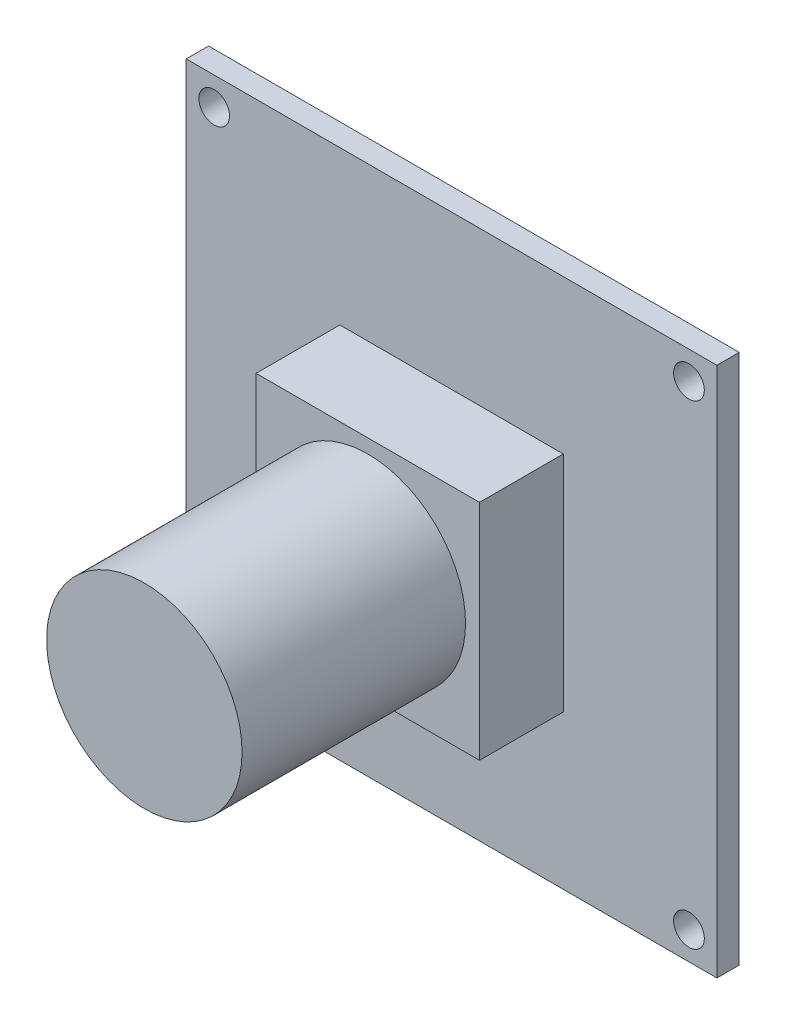
ISO-10303-21;
HEADER;
FILE_DESCRIPTION(('STEP AP214'),'2;1');
FILE_NAME('part.step','',(''),(''),'','','');
FILE_SCHEMA(('AUTOMOTIVE_DESIGN { 1 0 10303 214 1 1 1 1 }'));
ENDSEC;
DATA;
#1=APPLICATION_CONTEXT('core data for automotive mechanical design processes');
#2=APPLICATION_PROTOCOL_DEFINITION('international standard','automotive_design',2000,#1);
#3=PRODUCT_CONTEXT('',#1,'mechanical');
#4=PRODUCT('Part','Part','',(#3));
#5=PRODUCT_RELATED_PRODUCT_CATEGORY('part','',(#4));
#6=PRODUCT_DEFINITION_FORMATION('','',#4);
#7=PRODUCT_DEFINITION_CONTEXT('part definition',#1,'design');
#8=PRODUCT_DEFINITION('design','',#6,#7);
#9=PRODUCT_DEFINITION_SHAPE('','',#8);
#10=(LENGTH_UNIT() NAMED_UNIT(*) SI_UNIT(.MILLI.,.METRE.));
#11=(NAMED_UNIT(*) PLANE_ANGLE_UNIT() SI_UNIT($,.RADIAN.));
#12=(NAMED_UNIT(*) SI_UNIT($,.STERADIAN.) SOLID_ANGLE_UNIT());
#13=UNCERTAINTY_MEASURE_WITH_UNIT(LENGTH_MEASURE(1.E-05),#10,'distance_accuracy_value','');
#14=(GEOMETRIC_REPRESENTATION_CONTEXT(3) GLOBAL_UNCERTAINTY_ASSIGNED_CONTEXT((#13)) GLOBAL_UNIT_ASSIGNED_CONTEXT((#10,
#11,#12)) REPRESENTATION_CONTEXT('',''));
#15=CARTESIAN_POINT('',(0.,0.,0.));
#16=DIRECTION('',(0.,0.,1.));
#17=DIRECTION('',(1.,0.,0.));
#18=AXIS2_PLACEMENT_3D('',#15,#16,#17);
#19=CARTESIAN_POINT('',(0.,0.,23.6));
#20=DIRECTION('',(0.,0.,1.));
#21=DIRECTION('',(1.,0.,0.));
#22=AXIS2_PLACEMENT_3D('',#19,#20,#21);
#23=PLANE('',#22);
#24=CARTESIAN_POINT('',(0.,0.,23.6));
#25=DIRECTION('',(0.,0.,1.));
#26=DIRECTION('',(1.,0.,0.));
#27=AXIS2_PLACEMENT_3D('',#24,#25,#26);
#28=CIRCLE('',#27,7.);
#29=CARTESIAN_POINT('',(7.,0.,23.6));
#30=VERTEX_POINT('',#29);
#31=EDGE_CURVE('E25',#30,#30,#28,.T.);
#32=ORIENTED_EDGE('',*,*,#31,.T.);
#33=EDGE_LOOP('',(#32));
#34=FACE_BOUND('',#33,.T.);
#35=ADVANCED_FACE('F14',(#34),#23,.T.);
#36=CARTESIAN_POINT('',(0.,0.,7.6));
#37=DIRECTION('',(0.,0.,1.));
#38=DIRECTION('',(1.,0.,0.));
#39=AXIS2_PLACEMENT_3D('',#36,#37,#38);
#40=CYLINDRICAL_SURFACE('',#39,7.);
#41=ORIENTED_EDGE('',*,*,#31,.F.);
#42=DIRECTION('',(0.,0.,1.));
#43=VECTOR('',#42,1.);
#44=CARTESIAN_POINT('',(7.,0.,7.6));
#45=LINE('',#44,#43);
#46=CARTESIAN_POINT('',(7.,0.,7.6));
#47=VERTEX_POINT('',#46);
#48=EDGE_CURVE('E9',#47,#30,#45,.T.);
#49=ORIENTED_EDGE('',*,*,#48,.F.);
#50=CARTESIAN_POINT('',(0.,0.,7.6));
#51=DIRECTION('',(0.,0.,1.));
#52=DIRECTION('',(1.,0.,0.));
#53=AXIS2_PLACEMENT_3D('',#50,#51,#52);
#54=CIRCLE('',#53,7.);
#55=EDGE_CURVE('E18',#47,#47,#54,.T.);
#56=ORIENTED_EDGE('',*,*,#55,.T.);
#57=ORIENTED_EDGE('',*,*,#48,.T.);
#58=EDGE_LOOP('',(#41,#49,#56,#57));
#59=FACE_BOUND('',#58,.T.);
#60=ADVANCED_FACE('F334',(#59),#40,.T.);
#61=CARTESIAN_POINT('',(-8.,-8.,7.6));
#62=DIRECTION('',(0.,0.,1.));
#63=DIRECTION('',(1.,0.,0.));
#64=AXIS2_PLACEMENT_3D('',#61,#62,#63);
#65=PLANE('',#64);
#66=ORIENTED_EDGE('',*,*,#55,.F.);
#67=EDGE_LOOP('',(#66));
#68=FACE_BOUND('',#67,.T.);
#69=DIRECTION('',(0.,1.,0.));
#70=VECTOR('',#69,1.);
#71=CARTESIAN_POINT('',(-8.,-8.,7.6));
#72=LINE('',#71,#70);
#73=CARTESIAN_POINT('',(-8.,-8.,7.6));
#74=VERTEX_POINT('',#73);
#75=CARTESIAN_POINT('',(-8.,8.,7.6));
#76=VERTEX_POINT('',#75);
#77=EDGE_CURVE('E206',#74,#76,#72,.T.);
#78=ORIENTED_EDGE('',*,*,#77,.F.);
#79=DIRECTION('',(1.,0.,0.));
#80=VECTOR('',#79,1.);
#81=CARTESIAN_POINT('',(-8.,-8.,7.6));
#82=LINE('',#81,#80);
#83=CARTESIAN_POINT('',(8.,-8.,7.6));
#84=VERTEX_POINT('',#83);
#85=EDGE_CURVE('E210',#74,#84,#82,.T.);
#86=ORIENTED_EDGE('',*,*,#85,.T.);
#87=DIRECTION('',(0.,1.,0.));
#88=VECTOR('',#87,1.);
#89=CARTESIAN_POINT('',(8.,-8.,7.6));
#90=LINE('',#89,#88);
#91=CARTESIAN_POINT('',(8.,8.,7.6));
#92=VERTEX_POINT('',#91);
#93=EDGE_CURVE('E234',#84,#92,#90,.T.);
#94=ORIENTED_EDGE('',*,*,#93,.T.);
#95=DIRECTION('',(1.,0.,0.));
#96=VECTOR('',#95,1.);
#97=CARTESIAN_POINT('',(-8.,8.,7.6));
#98=LINE('',#97,#96);
#99=EDGE_CURVE('E185',#76,#92,#98,.T.);
#100=ORIENTED_EDGE('',*,*,#99,.F.);
#101=EDGE_LOOP('',(#78,#86,#94,#100));
#102=FACE_BOUND('',#101,.T.);
#103=ADVANCED_FACE('F290',(#68,#102),#65,.T.);
#104=CARTESIAN_POINT('',(17.,17.,-2.5));
#105=DIRECTION('',(0.,0.,1.));
#106=DIRECTION('',(1.,0.,0.));
#107=AXIS2_PLACEMENT_3D('',#104,#105,#106);
#108=CYLINDRICAL_SURFACE('',#107,1.1);
#109=DIRECTION('',(0.,0.,1.));
#110=VECTOR('',#109,1.);
#111=CARTESIAN_POINT('',(18.1,17.,-2.5));
#112=LINE('',#111,#110);
#113=CARTESIAN_POINT('',(18.1,17.,0.));
#114=VERTEX_POINT('',#113);
#115=CARTESIAN_POINT('',(18.1,17.,1.6));
#116=VERTEX_POINT('',#115);
#117=EDGE_CURVE('E237',#114,#116,#112,.T.);
#118=ORIENTED_EDGE('',*,*,#117,.F.);
#119=CARTESIAN_POINT('',(17.,17.,0.));
#120=DIRECTION('',(0.,0.,1.));
#121=DIRECTION('',(1.,0.,0.));
#122=AXIS2_PLACEMENT_3D('',#119,#120,#121);
#123=CIRCLE('',#122,1.1);
#124=EDGE_CURVE('E178',#114,#114,#123,.T.);
#125=ORIENTED_EDGE('',*,*,#124,.F.);
#126=ORIENTED_EDGE('',*,*,#117,.T.);
#127=CARTESIAN_POINT('',(17.,17.,1.6));
#128=DIRECTION('',(0.,0.,1.));
#129=DIRECTION('',(1.,0.,0.));
#130=AXIS2_PLACEMENT_3D('',#127,#128,#129);
#131=CIRCLE('',#130,1.1);
#132=EDGE_CURVE('E153',#116,#116,#131,.T.);
#133=ORIENTED_EDGE('',*,*,#132,.T.);
#134=EDGE_LOOP('',(#118,#125,#126,#133));
#135=FACE_BOUND('',#134,.T.);
#136=ADVANCED_FACE('F346',(#135),#108,.F.);
#137=CARTESIAN_POINT('',(8.,-8.,1.6));
#138=DIRECTION('',(1.,0.,0.));
#139=DIRECTION('',(0.,1.,0.));
#140=AXIS2_PLACEMENT_3D('',#137,#138,#139);
#141=PLANE('',#140);
#142=DIRECTION('',(0.,0.,1.));
#143=VECTOR('',#142,1.);
#144=CARTESIAN_POINT('',(8.,-8.,1.6));
#145=LINE('',#144,#143);
#146=CARTESIAN_POINT('',(8.,-8.,1.6));
#147=VERTEX_POINT('',#146);
#148=EDGE_CURVE('E184',#147,#84,#145,.T.);
#149=ORIENTED_EDGE('',*,*,#148,.F.);
#150=DIRECTION('',(0.,1.,0.));
#151=VECTOR('',#150,1.);
#152=CARTESIAN_POINT('',(8.,-8.,1.6));
#153=LINE('',#152,#151);
#154=CARTESIAN_POINT('',(8.,8.,1.6));
#155=VERTEX_POINT('',#154);
#156=EDGE_CURVE('E219',#147,#155,#153,.T.);
#157=ORIENTED_EDGE('',*,*,#156,.T.);
#158=DIRECTION('',(0.,0.,1.));
#159=VECTOR('',#158,1.);
#160=CARTESIAN_POINT('',(8.,8.,1.6));
#161=LINE('',#160,#159);
#162=EDGE_CURVE('E180',#155,#92,#161,.T.);
#163=ORIENTED_EDGE('',*,*,#162,.T.);
#164=ORIENTED_EDGE('',*,*,#93,.F.);
#165=EDGE_LOOP('',(#149,#157,#163,#164));
#166=FACE_BOUND('',#165,.T.);
#167=ADVANCED_FACE('F293',(#166),#141,.T.);
#168=CARTESIAN_POINT('',(-8.,-8.,1.6));
#169=DIRECTION('',(0.,1.,0.));
#170=DIRECTION('',(1.,0.,0.));
#171=AXIS2_PLACEMENT_3D('',#168,#169,#170);
#172=PLANE('',#171);
#173=ORIENTED_EDGE('',*,*,#148,.T.);
#174=ORIENTED_EDGE('',*,*,#85,.F.);
#175=DIRECTION('',(0.,0.,1.));
#176=VECTOR('',#175,1.);
#177=CARTESIAN_POINT('',(-8.,-8.,1.6));
#178=LINE('',#177,#176);
#179=CARTESIAN_POINT('',(-8.,-8.,1.6));
#180=VERTEX_POINT('',#179);
#181=EDGE_CURVE('E267',#180,#74,#178,.T.);
#182=ORIENTED_EDGE('',*,*,#181,.F.);
#183=DIRECTION('',(1.,0.,0.));
#184=VECTOR('',#183,1.);
#185=CARTESIAN_POINT('',(-8.,-8.,1.6));
#186=LINE('',#185,#184);
#187=EDGE_CURVE('E227',#180,#147,#186,.T.);
#188=ORIENTED_EDGE('',*,*,#187,.T.);
#189=EDGE_LOOP('',(#173,#174,#182,#188));
#190=FACE_BOUND('',#189,.T.);
#191=ADVANCED_FACE('F345',(#190),#172,.F.);
#192=CARTESIAN_POINT('',(-8.,8.,1.6));
#193=DIRECTION('',(0.,1.,0.));
#194=DIRECTION('',(1.,0.,0.));
#195=AXIS2_PLACEMENT_3D('',#192,#193,#194);
#196=PLANE('',#195);
#197=DIRECTION('',(1.,0.,0.));
#198=VECTOR('',#197,1.);
#199=CARTESIAN_POINT('',(-8.,8.,1.6));
#200=LINE('',#199,#198);
#201=CARTESIAN_POINT('',(-8.,8.,1.6));
#202=VERTEX_POINT('',#201);
#203=EDGE_CURVE('E190',#202,#155,#200,.T.);
#204=ORIENTED_EDGE('',*,*,#203,.F.);
#205=DIRECTION('',(0.,0.,1.));
#206=VECTOR('',#205,1.);
#207=CARTESIAN_POINT('',(-8.,8.,1.6));
#208=LINE('',#207,#206);
#209=EDGE_CURVE('E222',#202,#76,#208,.T.);
#210=ORIENTED_EDGE('',*,*,#209,.T.);
#211=ORIENTED_EDGE('',*,*,#99,.T.);
#212=ORIENTED_EDGE('',*,*,#162,.F.);
#213=EDGE_LOOP('',(#204,#210,#211,#212));
#214=FACE_BOUND('',#213,.T.);
#215=ADVANCED_FACE('F286',(#214),#196,.T.);
#216=CARTESIAN_POINT('',(-8.,-8.,1.6));
#217=DIRECTION('',(1.,0.,0.));
#218=DIRECTION('',(0.,1.,0.));
#219=AXIS2_PLACEMENT_3D('',#216,#217,#218);
#220=PLANE('',#219);
#221=ORIENTED_EDGE('',*,*,#77,.T.);
#222=ORIENTED_EDGE('',*,*,#209,.F.);
#223=DIRECTION('',(0.,1.,0.));
#224=VECTOR('',#223,1.);
#225=CARTESIAN_POINT('',(-8.,-8.,1.6));
#226=LINE('',#225,#224);
#227=EDGE_CURVE('E186',#180,#202,#226,.T.);
#228=ORIENTED_EDGE('',*,*,#227,.F.);
#229=ORIENTED_EDGE('',*,*,#181,.T.);
#230=EDGE_LOOP('',(#221,#222,#228,#229));
#231=FACE_BOUND('',#230,.T.);
#232=ADVANCED_FACE('F16',(#231),#220,.F.);
#233=CARTESIAN_POINT('',(-17.,17.,-2.5));
#234=DIRECTION('',(0.,0.,1.));
#235=DIRECTION('',(1.,0.,0.));
#236=AXIS2_PLACEMENT_3D('',#233,#234,#235);
#237=CYLINDRICAL_SURFACE('',#236,1.1);
#238=DIRECTION('',(0.,0.,1.));
#239=VECTOR('',#238,1.);
#240=CARTESIAN_POINT('',(-15.9,17.,-2.5));
#241=LINE('',#240,#239);
#242=CARTESIAN_POINT('',(-15.9,17.,0.));
#243=VERTEX_POINT('',#242);
#244=CARTESIAN_POINT('',(-15.9,17.,1.6));
#245=VERTEX_POINT('',#244);
#246=EDGE_CURVE('E75',#243,#245,#241,.T.);
#247=ORIENTED_EDGE('',*,*,#246,.F.);
#248=CARTESIAN_POINT('',(-17.,17.,0.));
#249=DIRECTION('',(0.,0.,1.));
#250=DIRECTION('',(1.,0.,0.));
#251=AXIS2_PLACEMENT_3D('',#248,#249,#250);
#252=CIRCLE('',#251,1.1);
#253=EDGE_CURVE('E256',#243,#243,#252,.T.);
#254=ORIENTED_EDGE('',*,*,#253,.F.);
#255=ORIENTED_EDGE('',*,*,#246,.T.);
#256=CARTESIAN_POINT('',(-17.,17.,1.6));
#257=DIRECTION('',(0.,0.,1.));
#258=DIRECTION('',(1.,0.,0.));
#259=AXIS2_PLACEMENT_3D('',#256,#257,#258);
#260=CIRCLE('',#259,1.1);
#261=EDGE_CURVE('E191',#245,#245,#260,.T.);
#262=ORIENTED_EDGE('',*,*,#261,.T.);
#263=EDGE_LOOP('',(#247,#254,#255,#262));
#264=FACE_BOUND('',#263,.T.);
#265=ADVANCED_FACE('F347',(#264),#237,.F.);
#266=CARTESIAN_POINT('',(17.,-17.,-2.5));
#267=DIRECTION('',(0.,0.,1.));
#268=DIRECTION('',(1.,0.,0.));
#269=AXIS2_PLACEMENT_3D('',#266,#267,#268);
#270=CYLINDRICAL_SURFACE('',#269,1.1);
#271=DIRECTION('',(0.,0.,1.));
#272=VECTOR('',#271,1.);
#273=CARTESIAN_POINT('',(18.1,-17.,-2.5));
#274=LINE('',#273,#272);
#275=CARTESIAN_POINT('',(18.1,-17.,0.));
#276=VERTEX_POINT('',#275);
#277=CARTESIAN_POINT('',(18.1,-17.,1.6));
#278=VERTEX_POINT('',#277);
#279=EDGE_CURVE('E91',#276,#278,#274,.T.);
#280=ORIENTED_EDGE('',*,*,#279,.F.);
#281=CARTESIAN_POINT('',(17.,-17.,0.));
#282=DIRECTION('',(0.,0.,1.));
#283=DIRECTION('',(1.,0.,0.));
#284=AXIS2_PLACEMENT_3D('',#281,#282,#283);
#285=CIRCLE('',#284,1.1);
#286=EDGE_CURVE('E253',#276,#276,#285,.T.);
#287=ORIENTED_EDGE('',*,*,#286,.F.);
#288=ORIENTED_EDGE('',*,*,#279,.T.);
#289=CARTESIAN_POINT('',(17.,-17.,1.6));
#290=DIRECTION('',(0.,0.,1.));
#291=DIRECTION('',(1.,0.,0.));
#292=AXIS2_PLACEMENT_3D('',#289,#290,#291);
#293=CIRCLE('',#292,1.1);
#294=EDGE_CURVE('E261',#278,#278,#293,.T.);
#295=ORIENTED_EDGE('',*,*,#294,.T.);
#296=EDGE_LOOP('',(#280,#287,#288,#295));
#297=FACE_BOUND('',#296,.T.);
#298=ADVANCED_FACE('F349',(#297),#270,.F.);
#299=CARTESIAN_POINT('',(-17.,-17.,-2.5));
#300=DIRECTION('',(0.,0.,1.));
#301=DIRECTION('',(1.,0.,0.));
#302=AXIS2_PLACEMENT_3D('',#299,#300,#301);
#303=CYLINDRICAL_SURFACE('',#302,1.1);
#304=DIRECTION('',(0.,0.,1.));
#305=VECTOR('',#304,1.);
#306=CARTESIAN_POINT('',(-15.9,-17.,-2.5));
#307=LINE('',#306,#305);
#308=CARTESIAN_POINT('',(-15.9,-17.,0.));
#309=VERTEX_POINT('',#308);
#310=CARTESIAN_POINT('',(-15.9,-17.,1.6));
#311=VERTEX_POINT('',#310);
#312=EDGE_CURVE('E243',#309,#311,#307,.T.);
#313=ORIENTED_EDGE('',*,*,#312,.F.);
#314=CARTESIAN_POINT('',(-17.,-17.,0.));
#315=DIRECTION('',(0.,0.,1.));
#316=DIRECTION('',(1.,0.,0.));
#317=AXIS2_PLACEMENT_3D('',#314,#315,#316);
#318=CIRCLE('',#317,1.1);
#319=EDGE_CURVE('E240',#309,#309,#318,.T.);
#320=ORIENTED_EDGE('',*,*,#319,.F.);
#321=ORIENTED_EDGE('',*,*,#312,.T.);
#322=CARTESIAN_POINT('',(-17.,-17.,1.6));
#323=DIRECTION('',(0.,0.,1.));
#324=DIRECTION('',(1.,0.,0.));
#325=AXIS2_PLACEMENT_3D('',#322,#323,#324);
#326=CIRCLE('',#325,1.1);
#327=EDGE_CURVE('E195',#311,#311,#326,.T.);
#328=ORIENTED_EDGE('',*,*,#327,.T.);
#329=EDGE_LOOP('',(#313,#320,#321,#328));
#330=FACE_BOUND('',#329,.T.);
#331=ADVANCED_FACE('F315',(#330),#303,.F.);
#332=CARTESIAN_POINT('',(19.,-19.,0.));
#333=DIRECTION('',(1.,0.,0.));
#334=DIRECTION('',(0.,1.,0.));
#335=AXIS2_PLACEMENT_3D('',#332,#333,#334);
#336=PLANE('',#335);
#337=DIRECTION('',(0.,0.,1.));
#338=VECTOR('',#337,1.);
#339=CARTESIAN_POINT('',(19.,-19.,0.));
#340=LINE('',#339,#338);
#341=CARTESIAN_POINT('',(19.,-19.,0.));
#342=VERTEX_POINT('',#341);
#343=CARTESIAN_POINT('',(19.,-19.,1.6));
#344=VERTEX_POINT('',#343);
#345=EDGE_CURVE('E203',#342,#344,#340,.T.);
#346=ORIENTED_EDGE('',*,*,#345,.F.);
#347=DIRECTION('',(0.,1.,0.));
#348=VECTOR('',#347,1.);
#349=CARTESIAN_POINT('',(19.,-19.,0.));
#350=LINE('',#349,#348);
#351=CARTESIAN_POINT('',(19.,19.,0.));
#352=VERTEX_POINT('',#351);
#353=EDGE_CURVE('E233',#342,#352,#350,.T.);
#354=ORIENTED_EDGE('',*,*,#353,.T.);
#355=DIRECTION('',(0.,0.,1.));
#356=VECTOR('',#355,1.);
#357=CARTESIAN_POINT('',(19.,19.,0.));
#358=LINE('',#357,#356);
#359=CARTESIAN_POINT('',(19.,19.,1.6));
#360=VERTEX_POINT('',#359);
#361=EDGE_CURVE('E150',#352,#360,#358,.T.);
#362=ORIENTED_EDGE('',*,*,#361,.T.);
#363=DIRECTION('',(0.,1.,0.));
#364=VECTOR('',#363,1.);
#365=CARTESIAN_POINT('',(19.,-19.,1.6));
#366=LINE('',#365,#364);
#367=EDGE_CURVE('E196',#344,#360,#366,.T.);
#368=ORIENTED_EDGE('',*,*,#367,.F.);
#369=EDGE_LOOP('',(#346,#354,#362,#368));
#370=FACE_BOUND('',#369,.T.);
#371=ADVANCED_FACE('F319',(#370),#336,.T.);
#372=CARTESIAN_POINT('',(-19.,-19.,0.));
#373=DIRECTION('',(0.,0.,1.));
#374=DIRECTION('',(1.,0.,0.));
#375=AXIS2_PLACEMENT_3D('',#372,#373,#374);
#376=PLANE('',#375);
#377=ORIENTED_EDGE('',*,*,#124,.T.);
#378=EDGE_LOOP('',(#377));
#379=FACE_BOUND('',#378,.T.);
#380=ORIENTED_EDGE('',*,*,#253,.T.);
#381=EDGE_LOOP('',(#380));
#382=FACE_BOUND('',#381,.T.);
#383=ORIENTED_EDGE('',*,*,#286,.T.);
#384=EDGE_LOOP('',(#383));
#385=FACE_BOUND('',#384,.T.);
#386=ORIENTED_EDGE('',*,*,#319,.T.);
#387=EDGE_LOOP('',(#386));
#388=FACE_BOUND('',#387,.T.);
#389=DIRECTION('',(1.,0.,0.));
#390=VECTOR('',#389,1.);
#391=CARTESIAN_POINT('',(-19.,19.,0.));
#392=LINE('',#391,#390);
#393=CARTESIAN_POINT('',(-19.,19.,0.));
#394=VERTEX_POINT('',#393);
#395=EDGE_CURVE('E142',#394,#352,#392,.T.);
#396=ORIENTED_EDGE('',*,*,#395,.T.);
#397=ORIENTED_EDGE('',*,*,#353,.F.);
#398=DIRECTION('',(1.,0.,0.));
#399=VECTOR('',#398,1.);
#400=CARTESIAN_POINT('',(-19.,-19.,0.));
#401=LINE('',#400,#399);
#402=CARTESIAN_POINT('',(-19.,-19.,0.));
#403=VERTEX_POINT('',#402);
#404=EDGE_CURVE('E159',#403,#342,#401,.T.);
#405=ORIENTED_EDGE('',*,*,#404,.F.);
#406=DIRECTION('',(0.,1.,0.));
#407=VECTOR('',#406,1.);
#408=CARTESIAN_POINT('',(-19.,-19.,0.));
#409=LINE('',#408,#407);
#410=EDGE_CURVE('E156',#403,#394,#409,.T.);
#411=ORIENTED_EDGE('',*,*,#410,.T.);
#412=EDGE_LOOP('',(#396,#397,#405,#411));
#413=FACE_BOUND('',#412,.T.);
#414=ADVANCED_FACE('F157',(#379,#382,#385,#388,#413),#376,.F.);
#415=CARTESIAN_POINT('',(-19.,19.,0.));
#416=DIRECTION('',(0.,1.,0.));
#417=DIRECTION('',(1.,0.,0.));
#418=AXIS2_PLACEMENT_3D('',#415,#416,#417);
#419=PLANE('',#418);
#420=ORIENTED_EDGE('',*,*,#395,.F.);
#421=DIRECTION('',(0.,0.,1.));
#422=VECTOR('',#421,1.);
#423=CARTESIAN_POINT('',(-19.,19.,0.));
#424=LINE('',#423,#422);
#425=CARTESIAN_POINT('',(-19.,19.,1.6));
#426=VERTEX_POINT('',#425);
#427=EDGE_CURVE('E147',#394,#426,#424,.T.);
#428=ORIENTED_EDGE('',*,*,#427,.T.);
#429=DIRECTION('',(1.,0.,0.));
#430=VECTOR('',#429,1.);
#431=CARTESIAN_POINT('',(-19.,19.,1.6));
#432=LINE('',#431,#430);
#433=EDGE_CURVE('E192',#426,#360,#432,.T.);
#434=ORIENTED_EDGE('',*,*,#433,.T.);
#435=ORIENTED_EDGE('',*,*,#361,.F.);
#436=EDGE_LOOP('',(#420,#428,#434,#435));
#437=FACE_BOUND('',#436,.T.);
#438=ADVANCED_FACE('F144',(#437),#419,.T.);
#439=CARTESIAN_POINT('',(-19.,-19.,1.6));
#440=DIRECTION('',(0.,0.,1.));
#441=DIRECTION('',(1.,0.,0.));
#442=AXIS2_PLACEMENT_3D('',#439,#440,#441);
#443=PLANE('',#442);
#444=ORIENTED_EDGE('',*,*,#132,.F.);
#445=EDGE_LOOP('',(#444));
#446=FACE_BOUND('',#445,.T.);
#447=ORIENTED_EDGE('',*,*,#227,.T.);
#448=ORIENTED_EDGE('',*,*,#203,.T.);
#449=ORIENTED_EDGE('',*,*,#156,.F.);
#450=ORIENTED_EDGE('',*,*,#187,.F.);
#451=EDGE_LOOP('',(#447,#448,#449,#450));
#452=FACE_BOUND('',#451,.T.);
#453=ORIENTED_EDGE('',*,*,#261,.F.);
#454=EDGE_LOOP('',(#453));
#455=FACE_BOUND('',#454,.T.);
#456=ORIENTED_EDGE('',*,*,#294,.F.);
#457=EDGE_LOOP('',(#456));
#458=FACE_BOUND('',#457,.T.);
#459=ORIENTED_EDGE('',*,*,#327,.F.);
#460=EDGE_LOOP('',(#459));
#461=FACE_BOUND('',#460,.T.);
#462=DIRECTION('',(0.,1.,0.));
#463=VECTOR('',#462,1.);
#464=CARTESIAN_POINT('',(-19.,-19.,1.6));
#465=LINE('',#464,#463);
#466=CARTESIAN_POINT('',(-19.,-19.,1.6));
#467=VERTEX_POINT('',#466);
#468=EDGE_CURVE('E168',#467,#426,#465,.T.);
#469=ORIENTED_EDGE('',*,*,#468,.F.);
#470=DIRECTION('',(1.,0.,0.));
#471=VECTOR('',#470,1.);
#472=CARTESIAN_POINT('',(-19.,-19.,1.6));
#473=LINE('',#472,#471);
#474=EDGE_CURVE('E199',#467,#344,#473,.T.);
#475=ORIENTED_EDGE('',*,*,#474,.T.);
#476=ORIENTED_EDGE('',*,*,#367,.T.);
#477=ORIENTED_EDGE('',*,*,#433,.F.);
#478=EDGE_LOOP('',(#469,#475,#476,#477));
#479=FACE_BOUND('',#478,.T.);
#480=ADVANCED_FACE('F297',(#446,#452,#455,#458,#461,#479),#443,.T.);
#481=CARTESIAN_POINT('',(-19.,-19.,0.));
#482=DIRECTION('',(0.,1.,0.));
#483=DIRECTION('',(1.,0.,0.));
#484=AXIS2_PLACEMENT_3D('',#481,#482,#483);
#485=PLANE('',#484);
#486=ORIENTED_EDGE('',*,*,#345,.T.);
#487=ORIENTED_EDGE('',*,*,#474,.F.);
#488=DIRECTION('',(0.,0.,1.));
#489=VECTOR('',#488,1.);
#490=CARTESIAN_POINT('',(-19.,-19.,0.));
#491=LINE('',#490,#489);
#492=EDGE_CURVE('E164',#403,#467,#491,.T.);
#493=ORIENTED_EDGE('',*,*,#492,.F.);
#494=ORIENTED_EDGE('',*,*,#404,.T.);
#495=EDGE_LOOP('',(#486,#487,#493,#494));
#496=FACE_BOUND('',#495,.T.);
#497=ADVANCED_FACE('F361',(#496),#485,.F.);
#498=CARTESIAN_POINT('',(-19.,-19.,0.));
#499=DIRECTION('',(1.,0.,0.));
#500=DIRECTION('',(0.,1.,0.));
#501=AXIS2_PLACEMENT_3D('',#498,#499,#500);
#502=PLANE('',#501);
#503=ORIENTED_EDGE('',*,*,#468,.T.);
#504=ORIENTED_EDGE('',*,*,#427,.F.);
#505=ORIENTED_EDGE('',*,*,#410,.F.);
#506=ORIENTED_EDGE('',*,*,#492,.T.);
#507=EDGE_LOOP('',(#503,#504,#505,#506));
#508=FACE_BOUND('',#507,.T.);
#509=ADVANCED_FACE('F166',(#508),#502,.F.);
#510=CLOSED_SHELL('',(#35,#60,#103,#136,#167,#191,#215,#232,#265,#298,#331,#371,#414,#438,#480,
#497,#509));
#511=MANIFOLD_SOLID_BREP('B1',#510);
#512=ADVANCED_BREP_SHAPE_REPRESENTATION('',(#18,#511),#14);
#513=SHAPE_DEFINITION_REPRESENTATION(#9,#512);
ENDSEC;
END-ISO-10303-21;
